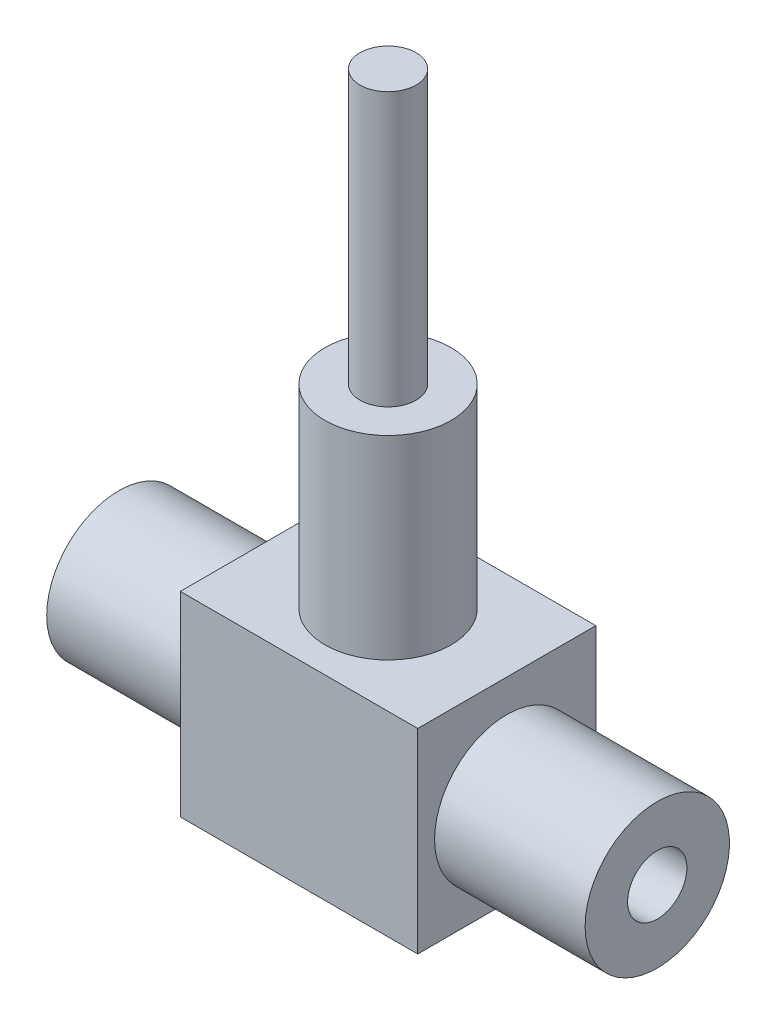
ISO-10303-21;
HEADER;
FILE_DESCRIPTION(('STEP AP214'),'2;1');
FILE_NAME('part.step','',(''),(''),'','','');
FILE_SCHEMA(('AUTOMOTIVE_DESIGN { 1 0 10303 214 1 1 1 1 }'));
ENDSEC;
DATA;
#1=APPLICATION_CONTEXT('core data for automotive mechanical design processes');
#2=APPLICATION_PROTOCOL_DEFINITION('international standard','automotive_design',2000,#1);
#3=PRODUCT_CONTEXT('',#1,'mechanical');
#4=PRODUCT('Part','Part','',(#3));
#5=PRODUCT_RELATED_PRODUCT_CATEGORY('part','',(#4));
#6=PRODUCT_DEFINITION_FORMATION('','',#4);
#7=PRODUCT_DEFINITION_CONTEXT('part definition',#1,'design');
#8=PRODUCT_DEFINITION('design','',#6,#7);
#9=PRODUCT_DEFINITION_SHAPE('','',#8);
#10=(LENGTH_UNIT() NAMED_UNIT(*) SI_UNIT(.MILLI.,.METRE.));
#11=(NAMED_UNIT(*) PLANE_ANGLE_UNIT() SI_UNIT($,.RADIAN.));
#12=(NAMED_UNIT(*) SI_UNIT($,.STERADIAN.) SOLID_ANGLE_UNIT());
#13=UNCERTAINTY_MEASURE_WITH_UNIT(LENGTH_MEASURE(1.E-05),#10,'distance_accuracy_value','');
#14=(GEOMETRIC_REPRESENTATION_CONTEXT(3) GLOBAL_UNCERTAINTY_ASSIGNED_CONTEXT((#13)) GLOBAL_UNIT_ASSIGNED_CONTEXT((#10,
#11,#12)) REPRESENTATION_CONTEXT('',''));
#15=CARTESIAN_POINT('',(0.,0.,0.));
#16=DIRECTION('',(0.,0.,1.));
#17=DIRECTION('',(1.,0.,0.));
#18=AXIS2_PLACEMENT_3D('',#15,#16,#17);
#19=CARTESIAN_POINT('',(-12.7,11.2,9.525));
#20=DIRECTION('',(1.,0.,0.));
#21=DIRECTION('',(0.,0.,-1.));
#22=AXIS2_PLACEMENT_3D('',#19,#20,#21);
#23=PLANE('',#22);
#24=CARTESIAN_POINT('',(-12.7,0.,0.));
#25=DIRECTION('',(-1.,0.,0.));
#26=DIRECTION('',(0.,0.,1.));
#27=AXIS2_PLACEMENT_3D('',#24,#25,#26);
#28=CIRCLE('',#27,7.722);
#29=CARTESIAN_POINT('',(-12.7,0.,7.722));
#30=VERTEX_POINT('',#29);
#31=EDGE_CURVE('E11',#30,#30,#28,.T.);
#32=ORIENTED_EDGE('',*,*,#31,.F.);
#33=EDGE_LOOP('',(#32));
#34=FACE_BOUND('',#33,.T.);
#35=DIRECTION('',(0.,-1.,0.));
#36=VECTOR('',#35,1.);
#37=CARTESIAN_POINT('',(-12.7,11.2,-9.525));
#38=LINE('',#37,#36);
#39=CARTESIAN_POINT('',(-12.7,11.2,-9.525));
#40=VERTEX_POINT('',#39);
#41=CARTESIAN_POINT('',(-12.7,-9.7,-9.525));
#42=VERTEX_POINT('',#41);
#43=EDGE_CURVE('E110',#40,#42,#38,.T.);
#44=ORIENTED_EDGE('',*,*,#43,.T.);
#45=DIRECTION('',(0.,0.,-1.));
#46=VECTOR('',#45,1.);
#47=CARTESIAN_POINT('',(-12.7,-9.7,9.525));
#48=LINE('',#47,#46);
#49=CARTESIAN_POINT('',(-12.7,-9.7,9.525));
#50=VERTEX_POINT('',#49);
#51=EDGE_CURVE('E48',#50,#42,#48,.T.);
#52=ORIENTED_EDGE('',*,*,#51,.F.);
#53=DIRECTION('',(0.,-1.,0.));
#54=VECTOR('',#53,1.);
#55=CARTESIAN_POINT('',(-12.7,11.2,9.525));
#56=LINE('',#55,#54);
#57=CARTESIAN_POINT('',(-12.7,11.2,9.525));
#58=VERTEX_POINT('',#57);
#59=EDGE_CURVE('E94',#58,#50,#56,.T.);
#60=ORIENTED_EDGE('',*,*,#59,.F.);
#61=DIRECTION('',(0.,0.,-1.));
#62=VECTOR('',#61,1.);
#63=CARTESIAN_POINT('',(-12.7,11.2,9.525));
#64=LINE('',#63,#62);
#65=EDGE_CURVE('E101',#58,#40,#64,.T.);
#66=ORIENTED_EDGE('',*,*,#65,.T.);
#67=EDGE_LOOP('',(#44,#52,#60,#66));
#68=FACE_BOUND('',#67,.T.);
#69=ADVANCED_FACE('F39',(#34,#68),#23,.F.);
#70=CARTESIAN_POINT('',(-12.7,-9.7,9.525));
#71=DIRECTION('',(0.,1.,0.));
#72=DIRECTION('',(0.,0.,1.));
#73=AXIS2_PLACEMENT_3D('',#70,#71,#72);
#74=PLANE('',#73);
#75=DIRECTION('',(1.,0.,0.));
#76=VECTOR('',#75,1.);
#77=CARTESIAN_POINT('',(-12.7,-9.7,-9.525));
#78=LINE('',#77,#76);
#79=CARTESIAN_POINT('',(12.7,-9.7,-9.525));
#80=VERTEX_POINT('',#79);
#81=EDGE_CURVE('E96',#42,#80,#78,.T.);
#82=ORIENTED_EDGE('',*,*,#81,.T.);
#83=DIRECTION('',(0.,0.,-1.));
#84=VECTOR('',#83,1.);
#85=CARTESIAN_POINT('',(12.7,-9.7,9.525));
#86=LINE('',#85,#84);
#87=CARTESIAN_POINT('',(12.7,-9.7,9.525));
#88=VERTEX_POINT('',#87);
#89=EDGE_CURVE('E98',#88,#80,#86,.T.);
#90=ORIENTED_EDGE('',*,*,#89,.F.);
#91=DIRECTION('',(1.,0.,0.));
#92=VECTOR('',#91,1.);
#93=CARTESIAN_POINT('',(-12.7,-9.7,9.525));
#94=LINE('',#93,#92);
#95=EDGE_CURVE('E89',#50,#88,#94,.T.);
#96=ORIENTED_EDGE('',*,*,#95,.F.);
#97=ORIENTED_EDGE('',*,*,#51,.T.);
#98=EDGE_LOOP('',(#82,#90,#96,#97));
#99=FACE_BOUND('',#98,.T.);
#100=ADVANCED_FACE('F97',(#99),#74,.F.);
#101=CARTESIAN_POINT('',(12.7,-9.7,9.525));
#102=DIRECTION('',(-1.,0.,0.));
#103=DIRECTION('',(0.,0.,1.));
#104=AXIS2_PLACEMENT_3D('',#101,#102,#103);
#105=PLANE('',#104);
#106=CARTESIAN_POINT('',(12.6999999999999,0.,0.));
#107=DIRECTION('',(-1.,0.,0.));
#108=DIRECTION('',(0.,0.,1.));
#109=AXIS2_PLACEMENT_3D('',#106,#107,#108);
#110=CIRCLE('',#109,7.722);
#111=CARTESIAN_POINT('',(12.6999999999999,0.,7.722));
#112=VERTEX_POINT('',#111);
#113=EDGE_CURVE('E124',#112,#112,#110,.T.);
#114=ORIENTED_EDGE('',*,*,#113,.T.);
#115=EDGE_LOOP('',(#114));
#116=FACE_BOUND('',#115,.T.);
#117=DIRECTION('',(0.,1.,0.));
#118=VECTOR('',#117,1.);
#119=CARTESIAN_POINT('',(12.7,-9.7,-9.525));
#120=LINE('',#119,#118);
#121=CARTESIAN_POINT('',(12.7,11.2,-9.525));
#122=VERTEX_POINT('',#121);
#123=EDGE_CURVE('E71',#80,#122,#120,.T.);
#124=ORIENTED_EDGE('',*,*,#123,.T.);
#125=DIRECTION('',(0.,0.,-1.));
#126=VECTOR('',#125,1.);
#127=CARTESIAN_POINT('',(12.7,11.2,9.525));
#128=LINE('',#127,#126);
#129=CARTESIAN_POINT('',(12.7,11.2,9.525));
#130=VERTEX_POINT('',#129);
#131=EDGE_CURVE('E100',#130,#122,#128,.T.);
#132=ORIENTED_EDGE('',*,*,#131,.F.);
#133=DIRECTION('',(0.,1.,0.));
#134=VECTOR('',#133,1.);
#135=CARTESIAN_POINT('',(12.7,-9.7,9.525));
#136=LINE('',#135,#134);
#137=EDGE_CURVE('E92',#88,#130,#136,.T.);
#138=ORIENTED_EDGE('',*,*,#137,.F.);
#139=ORIENTED_EDGE('',*,*,#89,.T.);
#140=EDGE_LOOP('',(#124,#132,#138,#139));
#141=FACE_BOUND('',#140,.T.);
#142=ADVANCED_FACE('F103',(#116,#141),#105,.F.);
#143=CARTESIAN_POINT('',(12.7,11.2,9.525));
#144=DIRECTION('',(0.,-1.,0.));
#145=DIRECTION('',(0.,0.,-1.));
#146=AXIS2_PLACEMENT_3D('',#143,#144,#145);
#147=PLANE('',#146);
#148=CARTESIAN_POINT('',(0.,11.2,0.));
#149=DIRECTION('',(0.,-1.,0.));
#150=DIRECTION('',(0.,0.,-1.));
#151=AXIS2_PLACEMENT_3D('',#148,#149,#150);
#152=CIRCLE('',#151,6.75);
#153=CARTESIAN_POINT('',(0.,11.2,-6.75));
#154=VERTEX_POINT('',#153);
#155=EDGE_CURVE('E179',#154,#154,#152,.T.);
#156=ORIENTED_EDGE('',*,*,#155,.T.);
#157=EDGE_LOOP('',(#156));
#158=FACE_BOUND('',#157,.T.);
#159=DIRECTION('',(-1.,0.,0.));
#160=VECTOR('',#159,1.);
#161=CARTESIAN_POINT('',(12.7,11.2,-9.525));
#162=LINE('',#161,#160);
#163=EDGE_CURVE('E78',#122,#40,#162,.T.);
#164=ORIENTED_EDGE('',*,*,#163,.T.);
#165=ORIENTED_EDGE('',*,*,#65,.F.);
#166=DIRECTION('',(-1.,0.,0.));
#167=VECTOR('',#166,1.);
#168=CARTESIAN_POINT('',(12.7,11.2,9.525));
#169=LINE('',#168,#167);
#170=EDGE_CURVE('E60',#130,#58,#169,.T.);
#171=ORIENTED_EDGE('',*,*,#170,.F.);
#172=ORIENTED_EDGE('',*,*,#131,.T.);
#173=EDGE_LOOP('',(#164,#165,#171,#172));
#174=FACE_BOUND('',#173,.T.);
#175=ADVANCED_FACE('F168',(#158,#174),#147,.F.);
#176=CARTESIAN_POINT('',(0.,0.,9.525));
#177=DIRECTION('',(0.,0.,1.));
#178=DIRECTION('',(1.,0.,0.));
#179=AXIS2_PLACEMENT_3D('',#176,#177,#178);
#180=PLANE('',#179);
#181=ORIENTED_EDGE('',*,*,#59,.T.);
#182=ORIENTED_EDGE('',*,*,#95,.T.);
#183=ORIENTED_EDGE('',*,*,#137,.T.);
#184=ORIENTED_EDGE('',*,*,#170,.T.);
#185=EDGE_LOOP('',(#181,#182,#183,#184));
#186=FACE_BOUND('',#185,.T.);
#187=ADVANCED_FACE('F88',(#186),#180,.T.);
#188=CARTESIAN_POINT('',(0.,0.,-9.525));
#189=DIRECTION('',(0.,0.,1.));
#190=DIRECTION('',(1.,0.,0.));
#191=AXIS2_PLACEMENT_3D('',#188,#189,#190);
#192=PLANE('',#191);
#193=ORIENTED_EDGE('',*,*,#43,.F.);
#194=ORIENTED_EDGE('',*,*,#163,.F.);
#195=ORIENTED_EDGE('',*,*,#123,.F.);
#196=ORIENTED_EDGE('',*,*,#81,.F.);
#197=EDGE_LOOP('',(#193,#194,#195,#196));
#198=FACE_BOUND('',#197,.T.);
#199=ADVANCED_FACE('F141',(#198),#192,.F.);
#200=CARTESIAN_POINT('',(28.8,0.,0.));
#201=DIRECTION('',(-1.,0.,0.));
#202=DIRECTION('',(0.,0.,1.));
#203=AXIS2_PLACEMENT_3D('',#200,#201,#202);
#204=PLANE('',#203);
#205=CARTESIAN_POINT('',(28.7999999999999,0.,0.));
#206=DIRECTION('',(-1.,0.,0.));
#207=DIRECTION('',(0.,0.,1.));
#208=AXIS2_PLACEMENT_3D('',#205,#206,#207);
#209=CIRCLE('',#208,3.175);
#210=CARTESIAN_POINT('',(28.7999999999999,0.,3.175));
#211=VERTEX_POINT('',#210);
#212=EDGE_CURVE('E116',#211,#211,#209,.F.);
#213=ORIENTED_EDGE('',*,*,#212,.F.);
#214=EDGE_LOOP('',(#213));
#215=FACE_BOUND('',#214,.T.);
#216=CARTESIAN_POINT('',(28.7999999999999,0.,0.));
#217=DIRECTION('',(-1.,0.,0.));
#218=DIRECTION('',(0.,0.,1.));
#219=AXIS2_PLACEMENT_3D('',#216,#217,#218);
#220=CIRCLE('',#219,7.722);
#221=CARTESIAN_POINT('',(28.7999999999999,0.,7.722));
#222=VERTEX_POINT('',#221);
#223=EDGE_CURVE('E109',#222,#222,#220,.T.);
#224=ORIENTED_EDGE('',*,*,#223,.F.);
#225=EDGE_LOOP('',(#224));
#226=FACE_BOUND('',#225,.T.);
#227=ADVANCED_FACE('F142',(#215,#226),#204,.F.);
#228=CARTESIAN_POINT('',(-1000.,0.,0.));
#229=DIRECTION('',(-1.,0.,0.));
#230=DIRECTION('',(0.,0.,1.));
#231=AXIS2_PLACEMENT_3D('',#228,#229,#230);
#232=CYLINDRICAL_SURFACE('',#231,7.722);
#233=ORIENTED_EDGE('',*,*,#113,.F.);
#234=EDGE_LOOP('',(#233));
#235=FACE_BOUND('',#234,.T.);
#236=ORIENTED_EDGE('',*,*,#223,.T.);
#237=EDGE_LOOP('',(#236));
#238=FACE_BOUND('',#237,.T.);
#239=ADVANCED_FACE('F136',(#235,#238),#232,.T.);
#240=CARTESIAN_POINT('',(-28.8,7.722,0.));
#241=DIRECTION('',(1.,0.,0.));
#242=DIRECTION('',(0.,0.,-1.));
#243=AXIS2_PLACEMENT_3D('',#240,#241,#242);
#244=PLANE('',#243);
#245=CARTESIAN_POINT('',(-28.8,0.,0.));
#246=DIRECTION('',(1.,0.,0.));
#247=DIRECTION('',(0.,0.,-1.));
#248=AXIS2_PLACEMENT_3D('',#245,#246,#247);
#249=CIRCLE('',#248,3.175);
#250=CARTESIAN_POINT('',(-28.8,0.,-3.175));
#251=VERTEX_POINT('',#250);
#252=EDGE_CURVE('E45',#251,#251,#249,.F.);
#253=ORIENTED_EDGE('',*,*,#252,.F.);
#254=EDGE_LOOP('',(#253));
#255=FACE_BOUND('',#254,.T.);
#256=CARTESIAN_POINT('',(-28.8,0.,0.));
#257=DIRECTION('',(-1.,0.,0.));
#258=DIRECTION('',(0.,0.,1.));
#259=AXIS2_PLACEMENT_3D('',#256,#257,#258);
#260=CIRCLE('',#259,7.722);
#261=CARTESIAN_POINT('',(-28.8,0.,7.722));
#262=VERTEX_POINT('',#261);
#263=EDGE_CURVE('E117',#262,#262,#260,.T.);
#264=ORIENTED_EDGE('',*,*,#263,.T.);
#265=EDGE_LOOP('',(#264));
#266=FACE_BOUND('',#265,.T.);
#267=ADVANCED_FACE('F151',(#255,#266),#244,.F.);
#268=CARTESIAN_POINT('',(-1000.,0.,0.));
#269=DIRECTION('',(-1.,0.,0.));
#270=DIRECTION('',(0.,0.,1.));
#271=AXIS2_PLACEMENT_3D('',#268,#269,#270);
#272=CYLINDRICAL_SURFACE('',#271,7.722);
#273=ORIENTED_EDGE('',*,*,#263,.F.);
#274=EDGE_LOOP('',(#273));
#275=FACE_BOUND('',#274,.T.);
#276=ORIENTED_EDGE('',*,*,#31,.T.);
#277=EDGE_LOOP('',(#276));
#278=FACE_BOUND('',#277,.T.);
#279=ADVANCED_FACE('F225',(#275,#278),#272,.T.);
#280=CARTESIAN_POINT('',(-1000.,0.,0.));
#281=DIRECTION('',(-1.,0.,0.));
#282=DIRECTION('',(0.,0.,1.));
#283=AXIS2_PLACEMENT_3D('',#280,#281,#282);
#284=CYLINDRICAL_SURFACE('',#283,3.175);
#285=CARTESIAN_POINT('',(13.6000000000001,0.,0.));
#286=DIRECTION('',(-1.,0.,0.));
#287=DIRECTION('',(0.,0.,1.));
#288=AXIS2_PLACEMENT_3D('',#285,#286,#287);
#289=CIRCLE('',#288,3.175);
#290=CARTESIAN_POINT('',(13.6000000000001,0.,3.175));
#291=VERTEX_POINT('',#290);
#292=EDGE_CURVE('E118',#291,#291,#289,.T.);
#293=ORIENTED_EDGE('',*,*,#292,.T.);
#294=EDGE_LOOP('',(#293));
#295=FACE_BOUND('',#294,.T.);
#296=ORIENTED_EDGE('',*,*,#212,.T.);
#297=EDGE_LOOP('',(#296));
#298=FACE_BOUND('',#297,.T.);
#299=ADVANCED_FACE('F220',(#295,#298),#284,.F.);
#300=CARTESIAN_POINT('',(13.6,3.175,0.));
#301=DIRECTION('',(1.,0.,0.));
#302=DIRECTION('',(0.,0.,-1.));
#303=AXIS2_PLACEMENT_3D('',#300,#301,#302);
#304=PLANE('',#303);
#305=ORIENTED_EDGE('',*,*,#292,.F.);
#306=EDGE_LOOP('',(#305));
#307=FACE_BOUND('',#306,.T.);
#308=ADVANCED_FACE('F216',(#307),#304,.T.);
#309=CARTESIAN_POINT('',(-1000.,0.,0.));
#310=DIRECTION('',(-1.,0.,0.));
#311=DIRECTION('',(0.,0.,1.));
#312=AXIS2_PLACEMENT_3D('',#309,#310,#311);
#313=CYLINDRICAL_SURFACE('',#312,3.175);
#314=CARTESIAN_POINT('',(-13.6000000000001,0.,0.));
#315=DIRECTION('',(-1.,0.,0.));
#316=DIRECTION('',(0.,0.,1.));
#317=AXIS2_PLACEMENT_3D('',#314,#315,#316);
#318=CIRCLE('',#317,3.175);
#319=CARTESIAN_POINT('',(-13.6000000000001,0.,3.175));
#320=VERTEX_POINT('',#319);
#321=EDGE_CURVE('E128',#320,#320,#318,.T.);
#322=ORIENTED_EDGE('',*,*,#321,.F.);
#323=EDGE_LOOP('',(#322));
#324=FACE_BOUND('',#323,.T.);
#325=ORIENTED_EDGE('',*,*,#252,.T.);
#326=EDGE_LOOP('',(#325));
#327=FACE_BOUND('',#326,.T.);
#328=ADVANCED_FACE('F214',(#324,#327),#313,.F.);
#329=CARTESIAN_POINT('',(-13.6,0.,0.));
#330=DIRECTION('',(-1.,0.,0.));
#331=DIRECTION('',(0.,0.,1.));
#332=AXIS2_PLACEMENT_3D('',#329,#330,#331);
#333=PLANE('',#332);
#334=ORIENTED_EDGE('',*,*,#321,.T.);
#335=EDGE_LOOP('',(#334));
#336=FACE_BOUND('',#335,.T.);
#337=ADVANCED_FACE('F212',(#336),#333,.T.);
#338=CARTESIAN_POINT('',(0.,-500.,0.));
#339=DIRECTION('',(0.,-1.,0.));
#340=DIRECTION('',(0.,0.,-1.));
#341=AXIS2_PLACEMENT_3D('',#338,#339,#340);
#342=CYLINDRICAL_SURFACE('',#341,6.75);
#343=CARTESIAN_POINT('',(0.,32.,0.));
#344=DIRECTION('',(0.,-1.,0.));
#345=DIRECTION('',(0.,0.,-1.));
#346=AXIS2_PLACEMENT_3D('',#343,#344,#345);
#347=CIRCLE('',#346,6.75);
#348=CARTESIAN_POINT('',(0.,32.,-6.75));
#349=VERTEX_POINT('',#348);
#350=EDGE_CURVE('E185',#349,#349,#347,.T.);
#351=ORIENTED_EDGE('',*,*,#350,.T.);
#352=EDGE_LOOP('',(#351));
#353=FACE_BOUND('',#352,.T.);
#354=ORIENTED_EDGE('',*,*,#155,.F.);
#355=EDGE_LOOP('',(#354));
#356=FACE_BOUND('',#355,.T.);
#357=ADVANCED_FACE('F206',(#353,#356),#342,.T.);
#358=CARTESIAN_POINT('',(6.75,32.,0.));
#359=DIRECTION('',(0.,1.,0.));
#360=DIRECTION('',(0.,0.,1.));
#361=AXIS2_PLACEMENT_3D('',#358,#359,#360);
#362=PLANE('',#361);
#363=CARTESIAN_POINT('',(0.,32.,0.));
#364=DIRECTION('',(0.,-1.,0.));
#365=DIRECTION('',(0.,0.,-1.));
#366=AXIS2_PLACEMENT_3D('',#363,#364,#365);
#367=CIRCLE('',#366,3.);
#368=CARTESIAN_POINT('',(0.,32.,-3.));
#369=VERTEX_POINT('',#368);
#370=EDGE_CURVE('E184',#369,#369,#367,.T.);
#371=ORIENTED_EDGE('',*,*,#370,.T.);
#372=EDGE_LOOP('',(#371));
#373=FACE_BOUND('',#372,.T.);
#374=ORIENTED_EDGE('',*,*,#350,.F.);
#375=EDGE_LOOP('',(#374));
#376=FACE_BOUND('',#375,.T.);
#377=ADVANCED_FACE('F204',(#373,#376),#362,.T.);
#378=CARTESIAN_POINT('',(0.,-500.,0.));
#379=DIRECTION('',(0.,-1.,0.));
#380=DIRECTION('',(0.,0.,-1.));
#381=AXIS2_PLACEMENT_3D('',#378,#379,#380);
#382=CYLINDRICAL_SURFACE('',#381,3.);
#383=CARTESIAN_POINT('',(0.,61.2,0.));
#384=DIRECTION('',(0.,-1.,0.));
#385=DIRECTION('',(0.,0.,-1.));
#386=AXIS2_PLACEMENT_3D('',#383,#384,#385);
#387=CIRCLE('',#386,3.);
#388=CARTESIAN_POINT('',(0.,61.2,-3.));
#389=VERTEX_POINT('',#388);
#390=EDGE_CURVE('E188',#389,#389,#387,.T.);
#391=ORIENTED_EDGE('',*,*,#390,.T.);
#392=EDGE_LOOP('',(#391));
#393=FACE_BOUND('',#392,.T.);
#394=ORIENTED_EDGE('',*,*,#370,.F.);
#395=EDGE_LOOP('',(#394));
#396=FACE_BOUND('',#395,.T.);
#397=ADVANCED_FACE('F191',(#393,#396),#382,.T.);
#398=CARTESIAN_POINT('',(3.,61.2,0.));
#399=DIRECTION('',(0.,1.,0.));
#400=DIRECTION('',(0.,0.,1.));
#401=AXIS2_PLACEMENT_3D('',#398,#399,#400);
#402=PLANE('',#401);
#403=ORIENTED_EDGE('',*,*,#390,.F.);
#404=EDGE_LOOP('',(#403));
#405=FACE_BOUND('',#404,.T.);
#406=ADVANCED_FACE('F197',(#405),#402,.T.);
#407=CLOSED_SHELL('',(#69,#100,#142,#175,#187,#199,#227,#239,#267,#279,#299,#308,#328,#337,#357,
#377,#397,#406));
#408=MANIFOLD_SOLID_BREP('B2',#407);
#409=ADVANCED_BREP_SHAPE_REPRESENTATION('',(#18,#408),#14);
#410=SHAPE_DEFINITION_REPRESENTATION(#9,#409);
ENDSEC;
END-ISO-10303-21;
